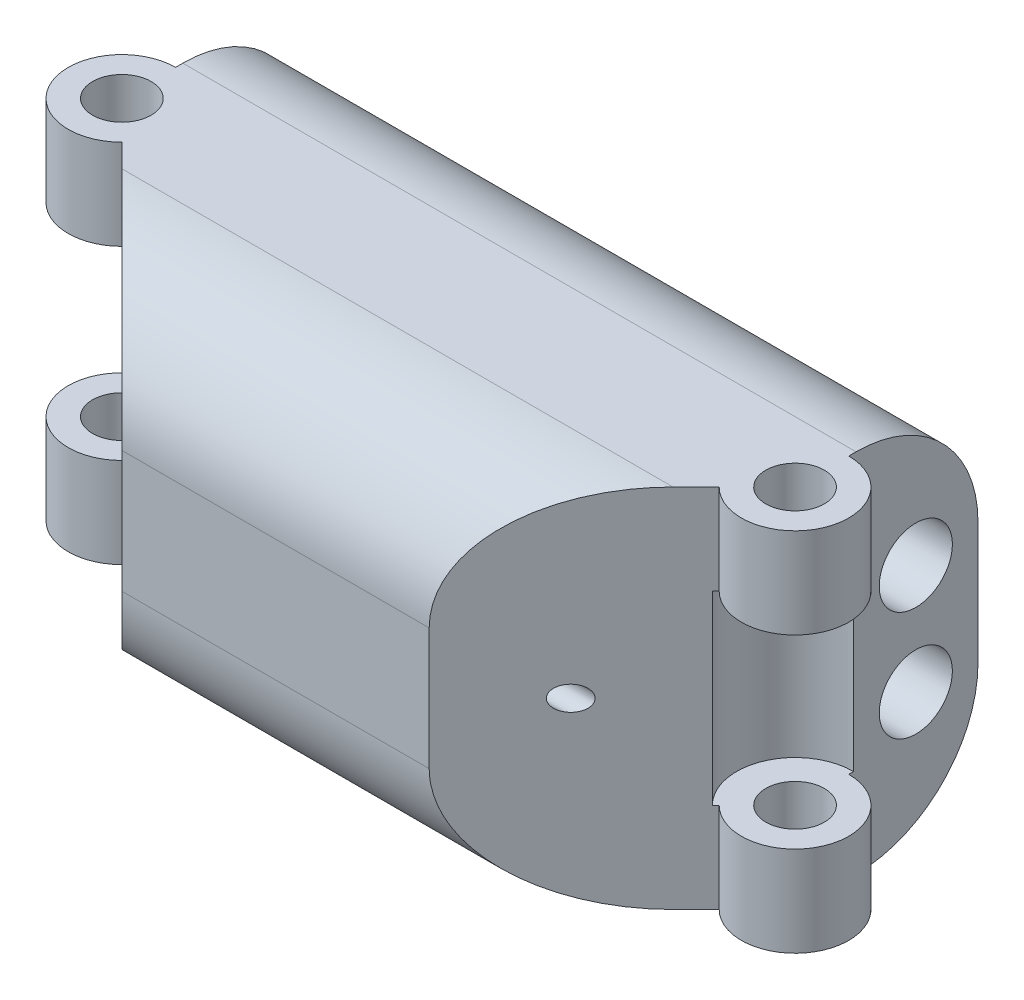
ISO-10303-21;
HEADER;
FILE_DESCRIPTION(('STEP AP214'),'2;1');
FILE_NAME('part.step','',(''),(''),'','','');
FILE_SCHEMA(('AUTOMOTIVE_DESIGN { 1 0 10303 214 1 1 1 1 }'));
ENDSEC;
DATA;
#1=APPLICATION_CONTEXT('core data for automotive mechanical design processes');
#2=APPLICATION_PROTOCOL_DEFINITION('international standard','automotive_design',2000,#1);
#3=PRODUCT_CONTEXT('',#1,'mechanical');
#4=PRODUCT('Part','Part','',(#3));
#5=PRODUCT_RELATED_PRODUCT_CATEGORY('part','',(#4));
#6=PRODUCT_DEFINITION_FORMATION('','',#4);
#7=PRODUCT_DEFINITION_CONTEXT('part definition',#1,'design');
#8=PRODUCT_DEFINITION('design','',#6,#7);
#9=PRODUCT_DEFINITION_SHAPE('','',#8);
#10=(LENGTH_UNIT() NAMED_UNIT(*) SI_UNIT(.MILLI.,.METRE.));
#11=(NAMED_UNIT(*) PLANE_ANGLE_UNIT() SI_UNIT($,.RADIAN.));
#12=(NAMED_UNIT(*) SI_UNIT($,.STERADIAN.) SOLID_ANGLE_UNIT());
#13=UNCERTAINTY_MEASURE_WITH_UNIT(LENGTH_MEASURE(1.E-05),#10,'distance_accuracy_value','');
#14=(GEOMETRIC_REPRESENTATION_CONTEXT(3) GLOBAL_UNCERTAINTY_ASSIGNED_CONTEXT((#13)) GLOBAL_UNIT_ASSIGNED_CONTEXT((#10,
#11,#12)) REPRESENTATION_CONTEXT('',''));
#15=CARTESIAN_POINT('',(0.,0.,0.));
#16=DIRECTION('',(0.,0.,1.));
#17=DIRECTION('',(1.,0.,0.));
#18=AXIS2_PLACEMENT_3D('',#15,#16,#17);
#19=CARTESIAN_POINT('',(-13.8,-7.5,0.));
#20=DIRECTION('',(0.,1.,0.));
#21=DIRECTION('',(0.,0.,1.));
#22=AXIS2_PLACEMENT_3D('',#19,#20,#21);
#23=CYLINDRICAL_SURFACE('',#22,2.4);
#24=CARTESIAN_POINT('',(-13.8,-3.8,0.));
#25=DIRECTION('',(0.,1.,0.));
#26=DIRECTION('',(0.,0.,-1.));
#27=AXIS2_PLACEMENT_3D('',#24,#25,#26);
#28=CIRCLE('',#27,2.4);
#29=CARTESIAN_POINT('',(-12.1029437251523,-3.8,1.69705627484772));
#30=VERTEX_POINT('',#29);
#31=CARTESIAN_POINT('',(-13.8,-3.8,-2.39999999999999));
#32=VERTEX_POINT('',#31);
#33=EDGE_CURVE('E226',#30,#32,#28,.T.);
#34=ORIENTED_EDGE('',*,*,#33,.F.);
#35=DIRECTION('',(0.,1.,0.));
#36=VECTOR('',#35,1.);
#37=CARTESIAN_POINT('',(-12.1029437251523,-7.5,1.69705627484771));
#38=LINE('',#37,#36);
#39=CARTESIAN_POINT('',(-12.1029437251523,3.8,1.69705627484771));
#40=VERTEX_POINT('',#39);
#41=EDGE_CURVE('E71',#30,#40,#38,.T.);
#42=ORIENTED_EDGE('',*,*,#41,.T.);
#43=CARTESIAN_POINT('',(-13.8,3.8,0.));
#44=DIRECTION('',(0.,1.,0.));
#45=DIRECTION('',(0.,0.,-1.));
#46=AXIS2_PLACEMENT_3D('',#43,#44,#45);
#47=CIRCLE('',#46,2.4);
#48=CARTESIAN_POINT('',(-13.8,3.8,-2.4));
#49=VERTEX_POINT('',#48);
#50=EDGE_CURVE('E276',#40,#49,#47,.T.);
#51=ORIENTED_EDGE('',*,*,#50,.T.);
#52=DIRECTION('',(0.,1.,0.));
#53=VECTOR('',#52,1.);
#54=CARTESIAN_POINT('',(-13.8,-7.5,-2.4));
#55=LINE('',#54,#53);
#56=EDGE_CURVE('E395',#32,#49,#55,.T.);
#57=ORIENTED_EDGE('',*,*,#56,.F.);
#58=EDGE_LOOP('',(#34,#42,#51,#57));
#59=FACE_BOUND('',#58,.T.);
#60=ADVANCED_FACE('F47',(#59),#23,.F.);
#61=CARTESIAN_POINT('',(13.8,-7.5,0.));
#62=DIRECTION('',(0.,1.,0.));
#63=DIRECTION('',(0.,0.,1.));
#64=AXIS2_PLACEMENT_3D('',#61,#62,#63);
#65=CYLINDRICAL_SURFACE('',#64,2.4);
#66=DIRECTION('',(0.,1.,0.));
#67=VECTOR('',#66,1.);
#68=CARTESIAN_POINT('',(12.1029437251523,-7.5,1.69705627484771));
#69=LINE('',#68,#67);
#70=CARTESIAN_POINT('',(12.1029437251523,-3.8,1.69705627484771));
#71=VERTEX_POINT('',#70);
#72=CARTESIAN_POINT('',(12.1029437251523,3.8,1.69705627484771));
#73=VERTEX_POINT('',#72);
#74=EDGE_CURVE('E63',#71,#73,#69,.T.);
#75=ORIENTED_EDGE('',*,*,#74,.F.);
#76=CARTESIAN_POINT('',(13.8,-3.8,0.));
#77=DIRECTION('',(0.,1.,0.));
#78=DIRECTION('',(0.,0.,1.));
#79=AXIS2_PLACEMENT_3D('',#76,#77,#78);
#80=CIRCLE('',#79,2.4);
#81=CARTESIAN_POINT('',(13.8,-3.8,-2.4));
#82=VERTEX_POINT('',#81);
#83=EDGE_CURVE('E243',#82,#71,#80,.T.);
#84=ORIENTED_EDGE('',*,*,#83,.F.);
#85=DIRECTION('',(0.,1.,0.));
#86=VECTOR('',#85,1.);
#87=CARTESIAN_POINT('',(13.8,-7.5,-2.4));
#88=LINE('',#87,#86);
#89=CARTESIAN_POINT('',(13.8,3.8,-2.4));
#90=VERTEX_POINT('',#89);
#91=EDGE_CURVE('E381',#82,#90,#88,.T.);
#92=ORIENTED_EDGE('',*,*,#91,.T.);
#93=CARTESIAN_POINT('',(13.8,3.8,0.));
#94=DIRECTION('',(0.,1.,0.));
#95=DIRECTION('',(0.,0.,1.));
#96=AXIS2_PLACEMENT_3D('',#93,#94,#95);
#97=CIRCLE('',#96,2.4);
#98=EDGE_CURVE('E324',#90,#73,#97,.T.);
#99=ORIENTED_EDGE('',*,*,#98,.T.);
#100=EDGE_LOOP('',(#75,#84,#92,#99));
#101=FACE_BOUND('',#100,.T.);
#102=ADVANCED_FACE('F500',(#101),#65,.F.);
#103=CARTESIAN_POINT('',(6.9,-7.5,6.9));
#104=DIRECTION('',(-0.707106781186547,0.,-0.707106781186548));
#105=DIRECTION('',(-0.707106781186548,0.,0.707106781186547));
#106=AXIS2_PLACEMENT_3D('',#103,#104,#105);
#107=PLANE('',#106);
#108=CARTESIAN_POINT('',(9.20147186257615,0.,4.59852813742385));
#109=DIRECTION('',(-0.707106781186547,0.,-0.707106781186548));
#110=DIRECTION('',(-0.707106781186548,0.,0.707106781186547));
#111=AXIS2_PLACEMENT_3D('',#108,#109,#110);
#112=ELLIPSE('',#111,0.707106781186548,0.5);
#113=CARTESIAN_POINT('',(8.70147186257615,0.,5.09852813742386));
#114=VERTEX_POINT('',#113);
#115=EDGE_CURVE('E340',#114,#114,#112,.T.);
#116=ORIENTED_EDGE('',*,*,#115,.T.);
#117=EDGE_LOOP('',(#116));
#118=FACE_BOUND('',#117,.T.);
#119=DIRECTION('',(-0.707106781186548,0.,0.707106781186547));
#120=VECTOR('',#119,1.);
#121=CARTESIAN_POINT('',(6.9,7.5,6.9));
#122=LINE('',#121,#120);
#123=CARTESIAN_POINT('',(12.2443650813896,7.5,1.5556349186104));
#124=VERTEX_POINT('',#123);
#125=CARTESIAN_POINT('',(11.3,7.5,2.5));
#126=VERTEX_POINT('',#125);
#127=EDGE_CURVE('E370',#124,#126,#122,.T.);
#128=ORIENTED_EDGE('',*,*,#127,.T.);
#129=CARTESIAN_POINT('',(11.3,2.5,2.5));
#130=DIRECTION('',(-0.707106781186547,0.,-0.707106781186548));
#131=DIRECTION('',(0.707106781186548,0.,-0.707106781186547));
#132=AXIS2_PLACEMENT_3D('',#129,#130,#131);
#133=ELLIPSE('',#132,7.07106781186548,5.);
#134=CARTESIAN_POINT('',(6.3,2.5,7.5));
#135=VERTEX_POINT('',#134);
#136=EDGE_CURVE('E56',#126,#135,#133,.F.);
#137=ORIENTED_EDGE('',*,*,#136,.T.);
#138=DIRECTION('',(0.,1.,0.));
#139=VECTOR('',#138,1.);
#140=CARTESIAN_POINT('',(6.3,-7.5,7.5));
#141=LINE('',#140,#139);
#142=CARTESIAN_POINT('',(6.3,-2.5,7.5));
#143=VERTEX_POINT('',#142);
#144=EDGE_CURVE('E385',#143,#135,#141,.T.);
#145=ORIENTED_EDGE('',*,*,#144,.F.);
#146=CARTESIAN_POINT('',(11.3,-2.5,2.5));
#147=DIRECTION('',(-0.707106781186547,0.,-0.707106781186548));
#148=DIRECTION('',(-0.707106781186548,0.,0.707106781186547));
#149=AXIS2_PLACEMENT_3D('',#146,#147,#148);
#150=ELLIPSE('',#149,7.07106781186548,5.);
#151=CARTESIAN_POINT('',(11.3,-7.5,2.5));
#152=VERTEX_POINT('',#151);
#153=EDGE_CURVE('E447',#143,#152,#150,.F.);
#154=ORIENTED_EDGE('',*,*,#153,.T.);
#155=DIRECTION('',(-0.707106781186548,0.,0.707106781186547));
#156=VECTOR('',#155,1.);
#157=CARTESIAN_POINT('',(6.9,-7.5,6.9));
#158=LINE('',#157,#156);
#159=CARTESIAN_POINT('',(12.2443650813896,-7.5,1.5556349186104));
#160=VERTEX_POINT('',#159);
#161=EDGE_CURVE('E378',#160,#152,#158,.T.);
#162=ORIENTED_EDGE('',*,*,#161,.F.);
#163=DIRECTION('',(0.,1.,0.));
#164=VECTOR('',#163,1.);
#165=CARTESIAN_POINT('',(12.2443650813896,-7.5,1.5556349186104));
#166=LINE('',#165,#164);
#167=CARTESIAN_POINT('',(12.2443650813896,-3.8,1.5556349186104));
#168=VERTEX_POINT('',#167);
#169=EDGE_CURVE('E252',#160,#168,#166,.T.);
#170=ORIENTED_EDGE('',*,*,#169,.T.);
#171=DIRECTION('',(0.707106781186548,0.,-0.707106781186546));
#172=VECTOR('',#171,1.);
#173=CARTESIAN_POINT('',(12.1029437251523,-3.8,1.69705627484771));
#174=LINE('',#173,#172);
#175=EDGE_CURVE('E257',#71,#168,#174,.T.);
#176=ORIENTED_EDGE('',*,*,#175,.F.);
#177=ORIENTED_EDGE('',*,*,#74,.T.);
#178=DIRECTION('',(0.707106781186548,0.,-0.707106781186546));
#179=VECTOR('',#178,1.);
#180=CARTESIAN_POINT('',(12.1029437251523,3.8,1.69705627484771));
#181=LINE('',#180,#179);
#182=CARTESIAN_POINT('',(12.2443650813896,3.8,1.5556349186104));
#183=VERTEX_POINT('',#182);
#184=EDGE_CURVE('E321',#73,#183,#181,.T.);
#185=ORIENTED_EDGE('',*,*,#184,.T.);
#186=DIRECTION('',(0.,-1.,0.));
#187=VECTOR('',#186,1.);
#188=CARTESIAN_POINT('',(12.2443650813896,7.5,1.5556349186104));
#189=LINE('',#188,#187);
#190=EDGE_CURVE('E237',#124,#183,#189,.T.);
#191=ORIENTED_EDGE('',*,*,#190,.F.);
#192=EDGE_LOOP('',(#128,#137,#145,#154,#162,#170,#176,#177,#185,#191));
#193=FACE_BOUND('',#192,.T.);
#194=ADVANCED_FACE('F452',(#118,#193),#107,.F.);
#195=CARTESIAN_POINT('',(0.,-7.5,7.5));
#196=DIRECTION('',(0.,0.,-1.));
#197=DIRECTION('',(-1.,0.,0.));
#198=AXIS2_PLACEMENT_3D('',#195,#196,#197);
#199=PLANE('',#198);
#200=ORIENTED_EDGE('',*,*,#144,.T.);
#201=DIRECTION('',(-1.,0.,0.));
#202=VECTOR('',#201,1.);
#203=CARTESIAN_POINT('',(-6.3,2.5,7.5));
#204=LINE('',#203,#202);
#205=CARTESIAN_POINT('',(-6.3,2.5,7.5));
#206=VERTEX_POINT('',#205);
#207=EDGE_CURVE('E434',#135,#206,#204,.T.);
#208=ORIENTED_EDGE('',*,*,#207,.T.);
#209=DIRECTION('',(0.,1.,0.));
#210=VECTOR('',#209,1.);
#211=CARTESIAN_POINT('',(-6.3,-7.5,7.5));
#212=LINE('',#211,#210);
#213=CARTESIAN_POINT('',(-6.3,-2.5,7.5));
#214=VERTEX_POINT('',#213);
#215=EDGE_CURVE('E389',#214,#206,#212,.T.);
#216=ORIENTED_EDGE('',*,*,#215,.F.);
#217=DIRECTION('',(-1.,0.,0.));
#218=VECTOR('',#217,1.);
#219=CARTESIAN_POINT('',(0.,-2.5,7.5));
#220=LINE('',#219,#218);
#221=EDGE_CURVE('E431',#214,#143,#220,.F.);
#222=ORIENTED_EDGE('',*,*,#221,.T.);
#223=EDGE_LOOP('',(#200,#208,#216,#222));
#224=FACE_BOUND('',#223,.T.);
#225=ADVANCED_FACE('F459',(#224),#199,.F.);
#226=CARTESIAN_POINT('',(-6.9,-7.5,6.9));
#227=DIRECTION('',(0.707106781186547,0.,-0.707106781186548));
#228=DIRECTION('',(-0.707106781186548,0.,-0.707106781186547));
#229=AXIS2_PLACEMENT_3D('',#226,#227,#228);
#230=PLANE('',#229);
#231=CARTESIAN_POINT('',(-9.20147186257615,0.,4.59852813742385));
#232=DIRECTION('',(0.707106781186547,0.,-0.707106781186548));
#233=DIRECTION('',(0.707106781186548,0.,0.707106781186547));
#234=AXIS2_PLACEMENT_3D('',#231,#232,#233);
#235=ELLIPSE('',#234,0.707106781186548,0.5);
#236=CARTESIAN_POINT('',(-8.70147186257615,0.,5.09852813742386));
#237=VERTEX_POINT('',#236);
#238=EDGE_CURVE('E305',#237,#237,#235,.F.);
#239=ORIENTED_EDGE('',*,*,#238,.F.);
#240=EDGE_LOOP('',(#239));
#241=FACE_BOUND('',#240,.T.);
#242=ORIENTED_EDGE('',*,*,#215,.T.);
#243=CARTESIAN_POINT('',(-11.3,2.5,2.5));
#244=DIRECTION('',(0.707106781186547,0.,-0.707106781186548));
#245=DIRECTION('',(0.707106781186548,0.,0.707106781186547));
#246=AXIS2_PLACEMENT_3D('',#243,#244,#245);
#247=ELLIPSE('',#246,7.07106781186548,5.);
#248=CARTESIAN_POINT('',(-11.3,7.5,2.5));
#249=VERTEX_POINT('',#248);
#250=EDGE_CURVE('E441',#206,#249,#247,.F.);
#251=ORIENTED_EDGE('',*,*,#250,.T.);
#252=DIRECTION('',(-0.707106781186548,0.,-0.707106781186547));
#253=VECTOR('',#252,1.);
#254=CARTESIAN_POINT('',(-6.9,7.5,6.9));
#255=LINE('',#254,#253);
#256=CARTESIAN_POINT('',(-12.2443650813896,7.5,1.55563491861041));
#257=VERTEX_POINT('',#256);
#258=EDGE_CURVE('E367',#249,#257,#255,.T.);
#259=ORIENTED_EDGE('',*,*,#258,.T.);
#260=DIRECTION('',(0.,-1.,0.));
#261=VECTOR('',#260,1.);
#262=CARTESIAN_POINT('',(-12.2443650813896,7.5,1.55563491861041));
#263=LINE('',#262,#261);
#264=CARTESIAN_POINT('',(-12.2443650813896,3.8,1.55563491861041));
#265=VERTEX_POINT('',#264);
#266=EDGE_CURVE('E286',#257,#265,#263,.T.);
#267=ORIENTED_EDGE('',*,*,#266,.T.);
#268=DIRECTION('',(0.707106781186548,0.,0.707106781186546));
#269=VECTOR('',#268,1.);
#270=CARTESIAN_POINT('',(-12.1029437251523,3.8,1.69705627484772));
#271=LINE('',#270,#269);
#272=EDGE_CURVE('E287',#265,#40,#271,.T.);
#273=ORIENTED_EDGE('',*,*,#272,.T.);
#274=ORIENTED_EDGE('',*,*,#41,.F.);
#275=DIRECTION('',(0.707106781186548,0.,0.707106781186546));
#276=VECTOR('',#275,1.);
#277=CARTESIAN_POINT('',(-12.1029437251523,-3.8,1.69705627484772));
#278=LINE('',#277,#276);
#279=CARTESIAN_POINT('',(-12.2443650813896,-3.8,1.55563491861041));
#280=VERTEX_POINT('',#279);
#281=EDGE_CURVE('E218',#280,#30,#278,.T.);
#282=ORIENTED_EDGE('',*,*,#281,.F.);
#283=DIRECTION('',(0.,1.,0.));
#284=VECTOR('',#283,1.);
#285=CARTESIAN_POINT('',(-12.2443650813896,-7.5,1.55563491861041));
#286=LINE('',#285,#284);
#287=CARTESIAN_POINT('',(-12.2443650813896,-7.5,1.55563491861041));
#288=VERTEX_POINT('',#287);
#289=EDGE_CURVE('E210',#288,#280,#286,.T.);
#290=ORIENTED_EDGE('',*,*,#289,.F.);
#291=DIRECTION('',(-0.707106781186548,0.,-0.707106781186547));
#292=VECTOR('',#291,1.);
#293=CARTESIAN_POINT('',(-6.9,-7.5,6.9));
#294=LINE('',#293,#292);
#295=CARTESIAN_POINT('',(-11.3,-7.5,2.5));
#296=VERTEX_POINT('',#295);
#297=EDGE_CURVE('E199',#296,#288,#294,.T.);
#298=ORIENTED_EDGE('',*,*,#297,.F.);
#299=CARTESIAN_POINT('',(-11.3,-2.5,2.5));
#300=DIRECTION('',(0.707106781186547,0.,-0.707106781186548));
#301=DIRECTION('',(-0.707106781186548,0.,-0.707106781186547));
#302=AXIS2_PLACEMENT_3D('',#299,#300,#301);
#303=ELLIPSE('',#302,7.07106781186548,5.);
#304=EDGE_CURVE('E438',#296,#214,#303,.F.);
#305=ORIENTED_EDGE('',*,*,#304,.T.);
#306=EDGE_LOOP('',(#242,#251,#259,#267,#273,#274,#282,#290,#298,#305));
#307=FACE_BOUND('',#306,.T.);
#308=ADVANCED_FACE('F465',(#241,#307),#230,.F.);
#309=CARTESIAN_POINT('',(-13.8,-7.5,0.));
#310=DIRECTION('',(1.,0.,0.));
#311=DIRECTION('',(0.,0.,-1.));
#312=AXIS2_PLACEMENT_3D('',#309,#310,#311);
#313=PLANE('',#312);
#314=CARTESIAN_POINT('',(-13.8,-2.25,-4.95));
#315=DIRECTION('',(1.,0.,0.));
#316=DIRECTION('',(0.,0.,-1.));
#317=AXIS2_PLACEMENT_3D('',#314,#315,#316);
#318=CIRCLE('',#317,1.5);
#319=CARTESIAN_POINT('',(-13.8,-2.25,-6.45));
#320=VERTEX_POINT('',#319);
#321=EDGE_CURVE('E349',#320,#320,#318,.F.);
#322=ORIENTED_EDGE('',*,*,#321,.F.);
#323=EDGE_LOOP('',(#322));
#324=FACE_BOUND('',#323,.T.);
#325=CARTESIAN_POINT('',(-13.8,2.25,-4.95));
#326=DIRECTION('',(1.,0.,0.));
#327=DIRECTION('',(0.,0.,-1.));
#328=AXIS2_PLACEMENT_3D('',#325,#326,#327);
#329=CIRCLE('',#328,1.5);
#330=CARTESIAN_POINT('',(-13.8,2.25,-6.45));
#331=VERTEX_POINT('',#330);
#332=EDGE_CURVE('E350',#331,#331,#329,.F.);
#333=ORIENTED_EDGE('',*,*,#332,.F.);
#334=EDGE_LOOP('',(#333));
#335=FACE_BOUND('',#334,.T.);
#336=DIRECTION('',(0.,1.,0.));
#337=VECTOR('',#336,1.);
#338=CARTESIAN_POINT('',(-13.8,-7.5,-7.5));
#339=LINE('',#338,#337);
#340=CARTESIAN_POINT('',(-13.8,-2.5,-7.5));
#341=VERTEX_POINT('',#340);
#342=CARTESIAN_POINT('',(-13.8,2.5,-7.5));
#343=VERTEX_POINT('',#342);
#344=EDGE_CURVE('E398',#341,#343,#339,.T.);
#345=ORIENTED_EDGE('',*,*,#344,.F.);
#346=CARTESIAN_POINT('',(-13.8,-2.5,-2.5));
#347=DIRECTION('',(1.,0.,0.));
#348=DIRECTION('',(0.,0.,-1.));
#349=AXIS2_PLACEMENT_3D('',#346,#347,#348);
#350=CIRCLE('',#349,5.);
#351=CARTESIAN_POINT('',(-13.8,-7.5,-2.5));
#352=VERTEX_POINT('',#351);
#353=EDGE_CURVE('E193',#341,#352,#350,.F.);
#354=ORIENTED_EDGE('',*,*,#353,.T.);
#355=DIRECTION('',(0.,0.,-1.));
#356=VECTOR('',#355,1.);
#357=CARTESIAN_POINT('',(-13.8,-7.5,0.));
#358=LINE('',#357,#356);
#359=CARTESIAN_POINT('',(-13.8,-7.5,-2.19999999999999));
#360=VERTEX_POINT('',#359);
#361=EDGE_CURVE('E186',#360,#352,#358,.T.);
#362=ORIENTED_EDGE('',*,*,#361,.F.);
#363=DIRECTION('',(0.,1.,0.));
#364=VECTOR('',#363,1.);
#365=CARTESIAN_POINT('',(-13.8,-7.5,-2.19999999999999));
#366=LINE('',#365,#364);
#367=CARTESIAN_POINT('',(-13.8,-3.8,-2.19999999999999));
#368=VERTEX_POINT('',#367);
#369=EDGE_CURVE('E190',#360,#368,#366,.T.);
#370=ORIENTED_EDGE('',*,*,#369,.T.);
#371=DIRECTION('',(0.,0.,1.));
#372=VECTOR('',#371,1.);
#373=CARTESIAN_POINT('',(-13.8,-3.8,-2.39999999999999));
#374=LINE('',#373,#372);
#375=EDGE_CURVE('E230',#32,#368,#374,.T.);
#376=ORIENTED_EDGE('',*,*,#375,.F.);
#377=ORIENTED_EDGE('',*,*,#56,.T.);
#378=DIRECTION('',(0.,0.,1.));
#379=VECTOR('',#378,1.);
#380=CARTESIAN_POINT('',(-13.8,3.8,-2.39999999999999));
#381=LINE('',#380,#379);
#382=CARTESIAN_POINT('',(-13.8,3.8,-2.19999999999999));
#383=VERTEX_POINT('',#382);
#384=EDGE_CURVE('E290',#49,#383,#381,.T.);
#385=ORIENTED_EDGE('',*,*,#384,.T.);
#386=DIRECTION('',(0.,-1.,0.));
#387=VECTOR('',#386,1.);
#388=CARTESIAN_POINT('',(-13.8,7.5,-2.19999999999999));
#389=LINE('',#388,#387);
#390=CARTESIAN_POINT('',(-13.8,7.5,-2.19999999999999));
#391=VERTEX_POINT('',#390);
#392=EDGE_CURVE('E301',#391,#383,#389,.T.);
#393=ORIENTED_EDGE('',*,*,#392,.F.);
#394=DIRECTION('',(0.,0.,-1.));
#395=VECTOR('',#394,1.);
#396=CARTESIAN_POINT('',(-13.8,7.5,0.));
#397=LINE('',#396,#395);
#398=CARTESIAN_POINT('',(-13.8,7.5,-2.5));
#399=VERTEX_POINT('',#398);
#400=EDGE_CURVE('E363',#391,#399,#397,.T.);
#401=ORIENTED_EDGE('',*,*,#400,.T.);
#402=CARTESIAN_POINT('',(-13.8,2.5,-2.5));
#403=DIRECTION('',(1.,0.,0.));
#404=DIRECTION('',(0.,0.,-1.));
#405=AXIS2_PLACEMENT_3D('',#402,#403,#404);
#406=CIRCLE('',#405,5.);
#407=EDGE_CURVE('E423',#399,#343,#406,.F.);
#408=ORIENTED_EDGE('',*,*,#407,.T.);
#409=EDGE_LOOP('',(#345,#354,#362,#370,#376,#377,#385,#393,#401,#408));
#410=FACE_BOUND('',#409,.T.);
#411=ADVANCED_FACE('F189',(#324,#335,#410),#313,.F.);
#412=CARTESIAN_POINT('',(0.,-7.5,-7.5));
#413=DIRECTION('',(0.,0.,1.));
#414=DIRECTION('',(1.,0.,0.));
#415=AXIS2_PLACEMENT_3D('',#412,#413,#414);
#416=PLANE('',#415);
#417=DIRECTION('',(0.,1.,0.));
#418=VECTOR('',#417,1.);
#419=CARTESIAN_POINT('',(13.8,-7.5,-7.5));
#420=LINE('',#419,#418);
#421=CARTESIAN_POINT('',(13.8,-2.5,-7.5));
#422=VERTEX_POINT('',#421);
#423=CARTESIAN_POINT('',(13.8,2.5,-7.5));
#424=VERTEX_POINT('',#423);
#425=EDGE_CURVE('E402',#422,#424,#420,.T.);
#426=ORIENTED_EDGE('',*,*,#425,.F.);
#427=DIRECTION('',(1.,0.,0.));
#428=VECTOR('',#427,1.);
#429=CARTESIAN_POINT('',(0.,-2.5,-7.5));
#430=LINE('',#429,#428);
#431=EDGE_CURVE('E420',#422,#341,#430,.F.);
#432=ORIENTED_EDGE('',*,*,#431,.T.);
#433=ORIENTED_EDGE('',*,*,#344,.T.);
#434=DIRECTION('',(1.,0.,0.));
#435=VECTOR('',#434,1.);
#436=CARTESIAN_POINT('',(13.8,2.5,-7.5));
#437=LINE('',#436,#435);
#438=EDGE_CURVE('E416',#343,#424,#437,.T.);
#439=ORIENTED_EDGE('',*,*,#438,.T.);
#440=EDGE_LOOP('',(#426,#432,#433,#439));
#441=FACE_BOUND('',#440,.T.);
#442=ADVANCED_FACE('F521',(#441),#416,.F.);
#443=CARTESIAN_POINT('',(13.8,-7.5,0.));
#444=DIRECTION('',(-1.,0.,0.));
#445=DIRECTION('',(0.,0.,1.));
#446=AXIS2_PLACEMENT_3D('',#443,#444,#445);
#447=PLANE('',#446);
#448=CARTESIAN_POINT('',(13.8,-2.25,-4.95));
#449=DIRECTION('',(1.,0.,0.));
#450=DIRECTION('',(0.,0.,-1.));
#451=AXIS2_PLACEMENT_3D('',#448,#449,#450);
#452=CIRCLE('',#451,1.5);
#453=CARTESIAN_POINT('',(13.8,-2.25,-6.45));
#454=VERTEX_POINT('',#453);
#455=EDGE_CURVE('E345',#454,#454,#452,.T.);
#456=ORIENTED_EDGE('',*,*,#455,.F.);
#457=EDGE_LOOP('',(#456));
#458=FACE_BOUND('',#457,.T.);
#459=CARTESIAN_POINT('',(13.8,2.25,-4.95));
#460=DIRECTION('',(1.,0.,0.));
#461=DIRECTION('',(0.,0.,-1.));
#462=AXIS2_PLACEMENT_3D('',#459,#460,#461);
#463=CIRCLE('',#462,1.5);
#464=CARTESIAN_POINT('',(13.8,2.25,-6.45));
#465=VERTEX_POINT('',#464);
#466=EDGE_CURVE('E344',#465,#465,#463,.T.);
#467=ORIENTED_EDGE('',*,*,#466,.F.);
#468=EDGE_LOOP('',(#467));
#469=FACE_BOUND('',#468,.T.);
#470=DIRECTION('',(0.,0.,1.));
#471=VECTOR('',#470,1.);
#472=CARTESIAN_POINT('',(13.8,-7.5,0.));
#473=LINE('',#472,#471);
#474=CARTESIAN_POINT('',(13.8,-7.5,-2.5));
#475=VERTEX_POINT('',#474);
#476=CARTESIAN_POINT('',(13.8,-7.5,-2.2));
#477=VERTEX_POINT('',#476);
#478=EDGE_CURVE('E200',#475,#477,#473,.T.);
#479=ORIENTED_EDGE('',*,*,#478,.F.);
#480=CARTESIAN_POINT('',(13.8,-2.5,-2.5));
#481=DIRECTION('',(-1.,0.,0.));
#482=DIRECTION('',(0.,0.,1.));
#483=AXIS2_PLACEMENT_3D('',#480,#481,#482);
#484=CIRCLE('',#483,5.);
#485=EDGE_CURVE('E413',#475,#422,#484,.F.);
#486=ORIENTED_EDGE('',*,*,#485,.T.);
#487=ORIENTED_EDGE('',*,*,#425,.T.);
#488=CARTESIAN_POINT('',(13.8,2.5,-2.5));
#489=DIRECTION('',(-1.,0.,0.));
#490=DIRECTION('',(0.,0.,1.));
#491=AXIS2_PLACEMENT_3D('',#488,#489,#490);
#492=CIRCLE('',#491,5.);
#493=CARTESIAN_POINT('',(13.8,7.5,-2.5));
#494=VERTEX_POINT('',#493);
#495=EDGE_CURVE('E410',#424,#494,#492,.F.);
#496=ORIENTED_EDGE('',*,*,#495,.T.);
#497=DIRECTION('',(0.,0.,1.));
#498=VECTOR('',#497,1.);
#499=CARTESIAN_POINT('',(13.8,7.5,0.));
#500=LINE('',#499,#498);
#501=CARTESIAN_POINT('',(13.8,7.5,-2.2));
#502=VERTEX_POINT('',#501);
#503=EDGE_CURVE('E354',#494,#502,#500,.T.);
#504=ORIENTED_EDGE('',*,*,#503,.T.);
#505=DIRECTION('',(0.,-1.,0.));
#506=VECTOR('',#505,1.);
#507=CARTESIAN_POINT('',(13.8,7.5,-2.2));
#508=LINE('',#507,#506);
#509=CARTESIAN_POINT('',(13.8,3.8,-2.2));
#510=VERTEX_POINT('',#509);
#511=EDGE_CURVE('E309',#502,#510,#508,.T.);
#512=ORIENTED_EDGE('',*,*,#511,.T.);
#513=DIRECTION('',(0.,0.,-1.));
#514=VECTOR('',#513,1.);
#515=CARTESIAN_POINT('',(13.8,3.8,-2.4));
#516=LINE('',#515,#514);
#517=EDGE_CURVE('E314',#510,#90,#516,.T.);
#518=ORIENTED_EDGE('',*,*,#517,.T.);
#519=ORIENTED_EDGE('',*,*,#91,.F.);
#520=DIRECTION('',(0.,0.,-1.));
#521=VECTOR('',#520,1.);
#522=CARTESIAN_POINT('',(13.8,-3.8,-2.4));
#523=LINE('',#522,#521);
#524=CARTESIAN_POINT('',(13.8,-3.8,-2.2));
#525=VERTEX_POINT('',#524);
#526=EDGE_CURVE('E253',#525,#82,#523,.T.);
#527=ORIENTED_EDGE('',*,*,#526,.F.);
#528=DIRECTION('',(0.,1.,0.));
#529=VECTOR('',#528,1.);
#530=CARTESIAN_POINT('',(13.8,-7.5,-2.2));
#531=LINE('',#530,#529);
#532=EDGE_CURVE('E267',#477,#525,#531,.T.);
#533=ORIENTED_EDGE('',*,*,#532,.F.);
#534=EDGE_LOOP('',(#479,#486,#487,#496,#504,#512,#518,#519,#527,#533));
#535=FACE_BOUND('',#534,.T.);
#536=ADVANCED_FACE('F525',(#458,#469,#535),#447,.F.);
#537=CARTESIAN_POINT('',(0.,-7.5,0.));
#538=DIRECTION('',(0.,1.,0.));
#539=DIRECTION('',(0.,0.,1.));
#540=AXIS2_PLACEMENT_3D('',#537,#538,#539);
#541=PLANE('',#540);
#542=ORIENTED_EDGE('',*,*,#161,.T.);
#543=DIRECTION('',(-1.,0.,0.));
#544=VECTOR('',#543,1.);
#545=CARTESIAN_POINT('',(0.,-7.5,2.5));
#546=LINE('',#545,#544);
#547=EDGE_CURVE('E11',#152,#296,#546,.T.);
#548=ORIENTED_EDGE('',*,*,#547,.T.);
#549=ORIENTED_EDGE('',*,*,#297,.T.);
#550=CARTESIAN_POINT('',(-13.8,-7.5,0.));
#551=DIRECTION('',(0.,1.,0.));
#552=DIRECTION('',(0.,0.,-1.));
#553=AXIS2_PLACEMENT_3D('',#550,#551,#552);
#554=CIRCLE('',#553,2.2);
#555=EDGE_CURVE('E205',#360,#288,#554,.T.);
#556=ORIENTED_EDGE('',*,*,#555,.F.);
#557=ORIENTED_EDGE('',*,*,#361,.T.);
#558=DIRECTION('',(1.,0.,0.));
#559=VECTOR('',#558,1.);
#560=CARTESIAN_POINT('',(0.,-7.5,-2.5));
#561=LINE('',#560,#559);
#562=EDGE_CURVE('E384',#352,#475,#561,.T.);
#563=ORIENTED_EDGE('',*,*,#562,.T.);
#564=ORIENTED_EDGE('',*,*,#478,.T.);
#565=CARTESIAN_POINT('',(13.8,-7.5,0.));
#566=DIRECTION('',(0.,1.,0.));
#567=DIRECTION('',(0.,0.,1.));
#568=AXIS2_PLACEMENT_3D('',#565,#566,#567);
#569=CIRCLE('',#568,2.2);
#570=EDGE_CURVE('E248',#160,#477,#569,.T.);
#571=ORIENTED_EDGE('',*,*,#570,.F.);
#572=EDGE_LOOP('',(#542,#548,#549,#556,#557,#563,#564,#571));
#573=FACE_BOUND('',#572,.T.);
#574=CARTESIAN_POINT('',(13.8,-7.5,0.));
#575=DIRECTION('',(0.,1.,0.));
#576=DIRECTION('',(0.,0.,1.));
#577=AXIS2_PLACEMENT_3D('',#574,#575,#576);
#578=CIRCLE('',#577,1.2);
#579=CARTESIAN_POINT('',(13.8,-7.5,1.2));
#580=VERTEX_POINT('',#579);
#581=EDGE_CURVE('E239',#580,#580,#578,.T.);
#582=ORIENTED_EDGE('',*,*,#581,.T.);
#583=EDGE_LOOP('',(#582));
#584=FACE_BOUND('',#583,.T.);
#585=CARTESIAN_POINT('',(-13.8,-7.5,0.));
#586=DIRECTION('',(0.,1.,0.));
#587=DIRECTION('',(0.,0.,-1.));
#588=AXIS2_PLACEMENT_3D('',#585,#586,#587);
#589=CIRCLE('',#588,1.2);
#590=CARTESIAN_POINT('',(-13.8,-7.5,-1.19999999999999));
#591=VERTEX_POINT('',#590);
#592=EDGE_CURVE('E231',#591,#591,#589,.T.);
#593=ORIENTED_EDGE('',*,*,#592,.T.);
#594=EDGE_LOOP('',(#593));
#595=FACE_BOUND('',#594,.T.);
#596=ADVANCED_FACE('F213',(#573,#584,#595),#541,.F.);
#597=CARTESIAN_POINT('',(0.,7.5,0.));
#598=DIRECTION('',(0.,1.,0.));
#599=DIRECTION('',(0.,0.,1.));
#600=AXIS2_PLACEMENT_3D('',#597,#598,#599);
#601=PLANE('',#600);
#602=ORIENTED_EDGE('',*,*,#258,.F.);
#603=DIRECTION('',(-1.,0.,0.));
#604=VECTOR('',#603,1.);
#605=CARTESIAN_POINT('',(6.3,7.5,2.5));
#606=LINE('',#605,#604);
#607=EDGE_CURVE('E444',#249,#126,#606,.F.);
#608=ORIENTED_EDGE('',*,*,#607,.T.);
#609=ORIENTED_EDGE('',*,*,#127,.F.);
#610=CARTESIAN_POINT('',(13.8,7.5,0.));
#611=DIRECTION('',(0.,1.,0.));
#612=DIRECTION('',(0.,0.,1.));
#613=AXIS2_PLACEMENT_3D('',#610,#611,#612);
#614=CIRCLE('',#613,2.2);
#615=EDGE_CURVE('E313',#124,#502,#614,.T.);
#616=ORIENTED_EDGE('',*,*,#615,.T.);
#617=ORIENTED_EDGE('',*,*,#503,.F.);
#618=DIRECTION('',(1.,0.,0.));
#619=VECTOR('',#618,1.);
#620=CARTESIAN_POINT('',(-13.8,7.5,-2.5));
#621=LINE('',#620,#619);
#622=EDGE_CURVE('E428',#494,#399,#621,.F.);
#623=ORIENTED_EDGE('',*,*,#622,.T.);
#624=ORIENTED_EDGE('',*,*,#400,.F.);
#625=CARTESIAN_POINT('',(-13.8,7.5,0.));
#626=DIRECTION('',(0.,1.,0.));
#627=DIRECTION('',(0.,0.,-1.));
#628=AXIS2_PLACEMENT_3D('',#625,#626,#627);
#629=CIRCLE('',#628,2.2);
#630=EDGE_CURVE('E282',#391,#257,#629,.T.);
#631=ORIENTED_EDGE('',*,*,#630,.T.);
#632=EDGE_LOOP('',(#602,#608,#609,#616,#617,#623,#624,#631));
#633=FACE_BOUND('',#632,.T.);
#634=CARTESIAN_POINT('',(13.8,7.5,0.));
#635=DIRECTION('',(0.,1.,0.));
#636=DIRECTION('',(0.,0.,1.));
#637=AXIS2_PLACEMENT_3D('',#634,#635,#636);
#638=CIRCLE('',#637,1.2);
#639=CARTESIAN_POINT('',(13.8,7.5,1.2));
#640=VERTEX_POINT('',#639);
#641=EDGE_CURVE('E327',#640,#640,#638,.T.);
#642=ORIENTED_EDGE('',*,*,#641,.F.);
#643=EDGE_LOOP('',(#642));
#644=FACE_BOUND('',#643,.T.);
#645=CARTESIAN_POINT('',(-13.8,7.5,0.));
#646=DIRECTION('',(0.,1.,0.));
#647=DIRECTION('',(0.,0.,-1.));
#648=AXIS2_PLACEMENT_3D('',#645,#646,#647);
#649=CIRCLE('',#648,1.2);
#650=CARTESIAN_POINT('',(-13.8,7.5,-1.19999999999999));
#651=VERTEX_POINT('',#650);
#652=EDGE_CURVE('E272',#651,#651,#649,.T.);
#653=ORIENTED_EDGE('',*,*,#652,.F.);
#654=EDGE_LOOP('',(#653));
#655=FACE_BOUND('',#654,.T.);
#656=ADVANCED_FACE('F467',(#633,#644,#655),#601,.T.);
#657=CARTESIAN_POINT('',(-13.801,2.25,-4.95));
#658=DIRECTION('',(1.,0.,0.));
#659=DIRECTION('',(0.,0.,-1.));
#660=AXIS2_PLACEMENT_3D('',#657,#658,#659);
#661=CYLINDRICAL_SURFACE('',#660,1.5);
#662=CARTESIAN_POINT('',(13.8,2.25,-6.45));
#663=CARTESIAN_POINT('',(13.5125,2.25,-6.45));
#664=CARTESIAN_POINT('',(13.225,2.25,-6.45));
#665=CARTESIAN_POINT('',(12.65,2.25,-6.45));
#666=CARTESIAN_POINT('',(12.3625,2.25,-6.45));
#667=CARTESIAN_POINT('',(11.7875,2.25,-6.45));
#668=CARTESIAN_POINT('',(11.5,2.25,-6.45));
#669=CARTESIAN_POINT('',(10.925,2.25,-6.45));
#670=CARTESIAN_POINT('',(10.6375,2.25,-6.45));
#671=CARTESIAN_POINT('',(10.0625,2.25,-6.45));
#672=CARTESIAN_POINT('',(9.775,2.25,-6.45));
#673=CARTESIAN_POINT('',(9.2,2.25,-6.45));
#674=CARTESIAN_POINT('',(8.9125,2.25,-6.45));
#675=CARTESIAN_POINT('',(8.3375,2.25,-6.45));
#676=CARTESIAN_POINT('',(8.05,2.25,-6.45));
#677=CARTESIAN_POINT('',(7.475,2.25,-6.45));
#678=CARTESIAN_POINT('',(7.1875,2.25,-6.45));
#679=CARTESIAN_POINT('',(6.6125,2.25,-6.45));
#680=CARTESIAN_POINT('',(6.32499999999999,2.25,-6.45));
#681=CARTESIAN_POINT('',(5.74999999999999,2.25,-6.45));
#682=CARTESIAN_POINT('',(5.4625,2.25,-6.45));
#683=CARTESIAN_POINT('',(4.88749999999999,2.25,-6.45));
#684=CARTESIAN_POINT('',(4.59999999999999,2.25,-6.45));
#685=CARTESIAN_POINT('',(4.02499999999999,2.25,-6.45));
#686=CARTESIAN_POINT('',(3.73749999999999,2.25,-6.45));
#687=CARTESIAN_POINT('',(3.1625,2.25,-6.45));
#688=CARTESIAN_POINT('',(2.875,2.25,-6.45));
#689=CARTESIAN_POINT('',(2.3,2.25,-6.45));
#690=CARTESIAN_POINT('',(2.0125,2.25,-6.45));
#691=CARTESIAN_POINT('',(1.4375,2.25,-6.45));
#692=CARTESIAN_POINT('',(1.15,2.25,-6.45));
#693=CARTESIAN_POINT('',(0.574999999999997,2.25,-6.45));
#694=CARTESIAN_POINT('',(0.287499999999997,2.25,-6.45));
#695=CARTESIAN_POINT('',(-0.287500000000004,2.25,-6.45));
#696=CARTESIAN_POINT('',(-0.575000000000004,2.25,-6.45));
#697=CARTESIAN_POINT('',(-1.15,2.25,-6.45));
#698=CARTESIAN_POINT('',(-1.4375,2.25,-6.45));
#699=CARTESIAN_POINT('',(-2.0125,2.25,-6.45));
#700=CARTESIAN_POINT('',(-2.3,2.25,-6.45));
#701=CARTESIAN_POINT('',(-2.875,2.25,-6.45));
#702=CARTESIAN_POINT('',(-3.1625,2.25,-6.45));
#703=CARTESIAN_POINT('',(-3.7375,2.25,-6.45));
#704=CARTESIAN_POINT('',(-4.025,2.25,-6.45));
#705=CARTESIAN_POINT('',(-4.6,2.25,-6.45));
#706=CARTESIAN_POINT('',(-4.8875,2.25,-6.45));
#707=CARTESIAN_POINT('',(-5.4625,2.25,-6.45));
#708=CARTESIAN_POINT('',(-5.75,2.25,-6.45));
#709=CARTESIAN_POINT('',(-6.325,2.25,-6.45));
#710=CARTESIAN_POINT('',(-6.6125,2.25,-6.45));
#711=CARTESIAN_POINT('',(-7.1875,2.25,-6.45));
#712=CARTESIAN_POINT('',(-7.475,2.25,-6.45));
#713=CARTESIAN_POINT('',(-8.05,2.25,-6.45));
#714=CARTESIAN_POINT('',(-8.3375,2.25,-6.45));
#715=CARTESIAN_POINT('',(-8.9125,2.25,-6.45));
#716=CARTESIAN_POINT('',(-9.2,2.25,-6.45));
#717=CARTESIAN_POINT('',(-9.775,2.25,-6.45));
#718=CARTESIAN_POINT('',(-10.0625,2.25,-6.45));
#719=CARTESIAN_POINT('',(-10.6375,2.25,-6.45));
#720=CARTESIAN_POINT('',(-10.925,2.25,-6.45));
#721=CARTESIAN_POINT('',(-11.5,2.25,-6.45));
#722=CARTESIAN_POINT('',(-11.7875,2.25,-6.45));
#723=CARTESIAN_POINT('',(-12.3625,2.25,-6.45));
#724=CARTESIAN_POINT('',(-12.65,2.25,-6.45));
#725=CARTESIAN_POINT('',(-13.225,2.25,-6.45));
#726=CARTESIAN_POINT('',(-13.5125,2.25,-6.45));
#727=CARTESIAN_POINT('',(-13.8,2.25,-6.45));
#728=B_SPLINE_CURVE_WITH_KNOTS('',3,(#662,#663,#664,#665,#666,#667,#668,#669,#670,#671,#672,
#673,#674,#675,#676,#677,#678,#679,#680,#681,#682,#683,#684,#685,#686,#687,#688,#689,#690,#691,
#692,#693,#694,#695,#696,#697,#698,#699,#700,#701,#702,#703,#704,#705,#706,#707,#708,#709,#710,
#711,#712,#713,#714,#715,#716,#717,#718,#719,#720,#721,#722,#723,#724,#725,#726,#727),
.UNSPECIFIED.,.F.,.F.,(4,2,2,2,2,2,2,2,2,2,2,2,2,2,2,2,2,2,2,2,2,2,2,2,2,2,2,2,2,2,2,2,4),(0.,
0.862499999999999,1.725,2.5875,3.45,4.3125,5.175,6.0375,6.9,7.7625,8.625,9.4875,10.35,11.2125,
12.075,12.9375,13.8,14.6625,15.525,16.3875,17.25,18.1125,18.975,19.8375,20.7,21.5625,22.425,
23.2875,24.15,25.0125,25.875,26.7375,27.6),.UNSPECIFIED.);
#729=EDGE_CURVE('BSEAM557',#465,#331,#728,.T.);
#730=ORIENTED_EDGE('',*,*,#466,.T.);
#731=ORIENTED_EDGE('',*,*,#332,.T.);
#732=ORIENTED_EDGE('',*,*,#729,.T.);
#733=ORIENTED_EDGE('',*,*,#729,.F.);
#734=EDGE_LOOP('',(#730,#732,#731,#733));
#735=FACE_BOUND('',#734,.T.);
#736=ADVANCED_FACE('F557',(#735),#661,.F.);
#737=CARTESIAN_POINT('',(-13.801,-2.25,-4.95));
#738=DIRECTION('',(1.,0.,0.));
#739=DIRECTION('',(0.,0.,-1.));
#740=AXIS2_PLACEMENT_3D('',#737,#738,#739);
#741=CYLINDRICAL_SURFACE('',#740,1.5);
#742=CARTESIAN_POINT('',(13.8,-2.25,-6.45));
#743=CARTESIAN_POINT('',(13.5125,-2.25,-6.45));
#744=CARTESIAN_POINT('',(13.225,-2.25,-6.45));
#745=CARTESIAN_POINT('',(12.65,-2.25,-6.45));
#746=CARTESIAN_POINT('',(12.3625,-2.25,-6.45));
#747=CARTESIAN_POINT('',(11.7875,-2.25,-6.45));
#748=CARTESIAN_POINT('',(11.5,-2.25,-6.45));
#749=CARTESIAN_POINT('',(10.925,-2.25,-6.45));
#750=CARTESIAN_POINT('',(10.6375,-2.25,-6.45));
#751=CARTESIAN_POINT('',(10.0625,-2.25,-6.45));
#752=CARTESIAN_POINT('',(9.775,-2.25,-6.45));
#753=CARTESIAN_POINT('',(9.2,-2.25,-6.45));
#754=CARTESIAN_POINT('',(8.9125,-2.25,-6.45));
#755=CARTESIAN_POINT('',(8.3375,-2.25,-6.45));
#756=CARTESIAN_POINT('',(8.05,-2.25,-6.45));
#757=CARTESIAN_POINT('',(7.475,-2.25,-6.45));
#758=CARTESIAN_POINT('',(7.1875,-2.25,-6.45));
#759=CARTESIAN_POINT('',(6.6125,-2.25,-6.45));
#760=CARTESIAN_POINT('',(6.32499999999999,-2.25,-6.45));
#761=CARTESIAN_POINT('',(5.74999999999999,-2.25,-6.45));
#762=CARTESIAN_POINT('',(5.4625,-2.25,-6.45));
#763=CARTESIAN_POINT('',(4.88749999999999,-2.25,-6.45));
#764=CARTESIAN_POINT('',(4.59999999999999,-2.25,-6.45));
#765=CARTESIAN_POINT('',(4.02499999999999,-2.25,-6.45));
#766=CARTESIAN_POINT('',(3.73749999999999,-2.25,-6.45));
#767=CARTESIAN_POINT('',(3.1625,-2.25,-6.45));
#768=CARTESIAN_POINT('',(2.875,-2.25,-6.45));
#769=CARTESIAN_POINT('',(2.3,-2.25,-6.45));
#770=CARTESIAN_POINT('',(2.0125,-2.25,-6.45));
#771=CARTESIAN_POINT('',(1.4375,-2.25,-6.45));
#772=CARTESIAN_POINT('',(1.15,-2.25,-6.45));
#773=CARTESIAN_POINT('',(0.574999999999997,-2.25,-6.45));
#774=CARTESIAN_POINT('',(0.287499999999997,-2.25,-6.45));
#775=CARTESIAN_POINT('',(-0.287500000000004,-2.25,-6.45));
#776=CARTESIAN_POINT('',(-0.575000000000004,-2.25,-6.45));
#777=CARTESIAN_POINT('',(-1.15,-2.25,-6.45));
#778=CARTESIAN_POINT('',(-1.4375,-2.25,-6.45));
#779=CARTESIAN_POINT('',(-2.0125,-2.25,-6.45));
#780=CARTESIAN_POINT('',(-2.3,-2.25,-6.45));
#781=CARTESIAN_POINT('',(-2.875,-2.25,-6.45));
#782=CARTESIAN_POINT('',(-3.1625,-2.25,-6.45));
#783=CARTESIAN_POINT('',(-3.7375,-2.25,-6.45));
#784=CARTESIAN_POINT('',(-4.025,-2.25,-6.45));
#785=CARTESIAN_POINT('',(-4.6,-2.25,-6.45));
#786=CARTESIAN_POINT('',(-4.8875,-2.25,-6.45));
#787=CARTESIAN_POINT('',(-5.4625,-2.25,-6.45));
#788=CARTESIAN_POINT('',(-5.75,-2.25,-6.45));
#789=CARTESIAN_POINT('',(-6.325,-2.25,-6.45));
#790=CARTESIAN_POINT('',(-6.6125,-2.25,-6.45));
#791=CARTESIAN_POINT('',(-7.1875,-2.25,-6.45));
#792=CARTESIAN_POINT('',(-7.475,-2.25,-6.45));
#793=CARTESIAN_POINT('',(-8.05,-2.25,-6.45));
#794=CARTESIAN_POINT('',(-8.3375,-2.25,-6.45));
#795=CARTESIAN_POINT('',(-8.9125,-2.25,-6.45));
#796=CARTESIAN_POINT('',(-9.2,-2.25,-6.45));
#797=CARTESIAN_POINT('',(-9.775,-2.25,-6.45));
#798=CARTESIAN_POINT('',(-10.0625,-2.25,-6.45));
#799=CARTESIAN_POINT('',(-10.6375,-2.25,-6.45));
#800=CARTESIAN_POINT('',(-10.925,-2.25,-6.45));
#801=CARTESIAN_POINT('',(-11.5,-2.25,-6.45));
#802=CARTESIAN_POINT('',(-11.7875,-2.25,-6.45));
#803=CARTESIAN_POINT('',(-12.3625,-2.25,-6.45));
#804=CARTESIAN_POINT('',(-12.65,-2.25,-6.45));
#805=CARTESIAN_POINT('',(-13.225,-2.25,-6.45));
#806=CARTESIAN_POINT('',(-13.5125,-2.25,-6.45));
#807=CARTESIAN_POINT('',(-13.8,-2.25,-6.45));
#808=B_SPLINE_CURVE_WITH_KNOTS('',3,(#742,#743,#744,#745,#746,#747,#748,#749,#750,#751,#752,
#753,#754,#755,#756,#757,#758,#759,#760,#761,#762,#763,#764,#765,#766,#767,#768,#769,#770,#771,
#772,#773,#774,#775,#776,#777,#778,#779,#780,#781,#782,#783,#784,#785,#786,#787,#788,#789,#790,
#791,#792,#793,#794,#795,#796,#797,#798,#799,#800,#801,#802,#803,#804,#805,#806,#807),
.UNSPECIFIED.,.F.,.F.,(4,2,2,2,2,2,2,2,2,2,2,2,2,2,2,2,2,2,2,2,2,2,2,2,2,2,2,2,2,2,2,2,4),(0.,
0.862499999999999,1.725,2.5875,3.45,4.3125,5.175,6.0375,6.9,7.7625,8.625,9.4875,10.35,11.2125,
12.075,12.9375,13.8,14.6625,15.525,16.3875,17.25,18.1125,18.975,19.8375,20.7,21.5625,22.425,
23.2875,24.15,25.0125,25.875,26.7375,27.6),.UNSPECIFIED.);
#809=EDGE_CURVE('BSEAM559',#454,#320,#808,.T.);
#810=ORIENTED_EDGE('',*,*,#455,.T.);
#811=ORIENTED_EDGE('',*,*,#321,.T.);
#812=ORIENTED_EDGE('',*,*,#809,.T.);
#813=ORIENTED_EDGE('',*,*,#809,.F.);
#814=EDGE_LOOP('',(#810,#812,#811,#813));
#815=FACE_BOUND('',#814,.T.);
#816=ADVANCED_FACE('F559',(#815),#741,.F.);
#817=CARTESIAN_POINT('',(0.,-2.5,-2.5));
#818=DIRECTION('',(1.,0.,0.));
#819=DIRECTION('',(0.,0.,-1.));
#820=AXIS2_PLACEMENT_3D('',#817,#818,#819);
#821=CYLINDRICAL_SURFACE('',#820,5.);
#822=ORIENTED_EDGE('',*,*,#353,.F.);
#823=ORIENTED_EDGE('',*,*,#431,.F.);
#824=ORIENTED_EDGE('',*,*,#485,.F.);
#825=ORIENTED_EDGE('',*,*,#562,.F.);
#826=EDGE_LOOP('',(#822,#823,#824,#825));
#827=FACE_BOUND('',#826,.T.);
#828=ADVANCED_FACE('F524',(#827),#821,.T.);
#829=CARTESIAN_POINT('',(0.,2.5,-2.5));
#830=DIRECTION('',(-1.,0.,0.));
#831=DIRECTION('',(0.,0.,1.));
#832=AXIS2_PLACEMENT_3D('',#829,#830,#831);
#833=CYLINDRICAL_SURFACE('',#832,5.);
#834=ORIENTED_EDGE('',*,*,#407,.F.);
#835=ORIENTED_EDGE('',*,*,#622,.F.);
#836=ORIENTED_EDGE('',*,*,#495,.F.);
#837=ORIENTED_EDGE('',*,*,#438,.F.);
#838=EDGE_LOOP('',(#834,#835,#836,#837));
#839=FACE_BOUND('',#838,.T.);
#840=ADVANCED_FACE('F517',(#839),#833,.T.);
#841=CARTESIAN_POINT('',(13.801,0.,4.59852813742385));
#842=DIRECTION('',(-1.,0.,0.));
#843=DIRECTION('',(0.,0.,1.));
#844=AXIS2_PLACEMENT_3D('',#841,#842,#843);
#845=CYLINDRICAL_SURFACE('',#844,0.5);
#846=ORIENTED_EDGE('',*,*,#115,.F.);
#847=EDGE_LOOP('',(#846));
#848=FACE_BOUND('',#847,.T.);
#849=ORIENTED_EDGE('',*,*,#238,.T.);
#850=EDGE_LOOP('',(#849));
#851=FACE_BOUND('',#850,.T.);
#852=ADVANCED_FACE('F583',(#848,#851),#845,.F.);
#853=CARTESIAN_POINT('',(0.,2.5,2.5));
#854=DIRECTION('',(1.,0.,0.));
#855=DIRECTION('',(0.,0.,-1.));
#856=AXIS2_PLACEMENT_3D('',#853,#854,#855);
#857=CYLINDRICAL_SURFACE('',#856,5.);
#858=ORIENTED_EDGE('',*,*,#136,.F.);
#859=ORIENTED_EDGE('',*,*,#607,.F.);
#860=ORIENTED_EDGE('',*,*,#250,.F.);
#861=ORIENTED_EDGE('',*,*,#207,.F.);
#862=EDGE_LOOP('',(#858,#859,#860,#861));
#863=FACE_BOUND('',#862,.T.);
#864=ADVANCED_FACE('F462',(#863),#857,.T.);
#865=CARTESIAN_POINT('',(0.,-2.5,2.5));
#866=DIRECTION('',(-1.,0.,0.));
#867=DIRECTION('',(0.,0.,1.));
#868=AXIS2_PLACEMENT_3D('',#865,#866,#867);
#869=CYLINDRICAL_SURFACE('',#868,5.);
#870=ORIENTED_EDGE('',*,*,#153,.F.);
#871=ORIENTED_EDGE('',*,*,#221,.F.);
#872=ORIENTED_EDGE('',*,*,#304,.F.);
#873=ORIENTED_EDGE('',*,*,#547,.F.);
#874=EDGE_LOOP('',(#870,#871,#872,#873));
#875=FACE_BOUND('',#874,.T.);
#876=ADVANCED_FACE('F49',(#875),#869,.T.);
#877=CARTESIAN_POINT('',(13.8,3.8,0.));
#878=DIRECTION('',(0.,1.,0.));
#879=DIRECTION('',(0.,0.,1.));
#880=AXIS2_PLACEMENT_3D('',#877,#878,#879);
#881=PLANE('',#880);
#882=ORIENTED_EDGE('',*,*,#98,.F.);
#883=ORIENTED_EDGE('',*,*,#517,.F.);
#884=CARTESIAN_POINT('',(13.8,3.8,0.));
#885=DIRECTION('',(0.,1.,0.));
#886=DIRECTION('',(0.,0.,1.));
#887=AXIS2_PLACEMENT_3D('',#884,#885,#886);
#888=CIRCLE('',#887,2.2);
#889=EDGE_CURVE('E318',#183,#510,#888,.T.);
#890=ORIENTED_EDGE('',*,*,#889,.F.);
#891=ORIENTED_EDGE('',*,*,#184,.F.);
#892=EDGE_LOOP('',(#882,#883,#890,#891));
#893=FACE_BOUND('',#892,.T.);
#894=CARTESIAN_POINT('',(13.8,3.8,0.));
#895=DIRECTION('',(0.,1.,0.));
#896=DIRECTION('',(0.,0.,1.));
#897=AXIS2_PLACEMENT_3D('',#894,#895,#896);
#898=CIRCLE('',#897,1.2);
#899=CARTESIAN_POINT('',(13.8,3.8,1.2));
#900=VERTEX_POINT('',#899);
#901=EDGE_CURVE('E281',#900,#900,#898,.T.);
#902=ORIENTED_EDGE('',*,*,#901,.T.);
#903=EDGE_LOOP('',(#902));
#904=FACE_BOUND('',#903,.T.);
#905=ADVANCED_FACE('F506',(#893,#904),#881,.F.);
#906=CARTESIAN_POINT('',(13.8,7.5,0.));
#907=DIRECTION('',(0.,-1.,0.));
#908=DIRECTION('',(0.,0.,-1.));
#909=AXIS2_PLACEMENT_3D('',#906,#907,#908);
#910=CYLINDRICAL_SURFACE('',#909,2.2);
#911=ORIENTED_EDGE('',*,*,#889,.T.);
#912=ORIENTED_EDGE('',*,*,#511,.F.);
#913=ORIENTED_EDGE('',*,*,#615,.F.);
#914=ORIENTED_EDGE('',*,*,#190,.T.);
#915=EDGE_LOOP('',(#911,#912,#913,#914));
#916=FACE_BOUND('',#915,.T.);
#917=ADVANCED_FACE('F510',(#916),#910,.T.);
#918=CARTESIAN_POINT('',(13.8,7.5,0.));
#919=DIRECTION('',(0.,-1.,0.));
#920=DIRECTION('',(0.,0.,-1.));
#921=AXIS2_PLACEMENT_3D('',#918,#919,#920);
#922=CYLINDRICAL_SURFACE('',#921,1.2);
#923=ORIENTED_EDGE('',*,*,#641,.T.);
#924=EDGE_LOOP('',(#923));
#925=FACE_BOUND('',#924,.T.);
#926=ORIENTED_EDGE('',*,*,#901,.F.);
#927=EDGE_LOOP('',(#926));
#928=FACE_BOUND('',#927,.T.);
#929=ADVANCED_FACE('F615',(#925,#928),#922,.F.);
#930=CARTESIAN_POINT('',(-13.8,3.8,0.));
#931=DIRECTION('',(0.,-1.,0.));
#932=DIRECTION('',(0.,0.,-1.));
#933=AXIS2_PLACEMENT_3D('',#930,#931,#932);
#934=PLANE('',#933);
#935=ORIENTED_EDGE('',*,*,#50,.F.);
#936=ORIENTED_EDGE('',*,*,#272,.F.);
#937=CARTESIAN_POINT('',(-13.8,3.8,0.));
#938=DIRECTION('',(0.,1.,0.));
#939=DIRECTION('',(0.,0.,-1.));
#940=AXIS2_PLACEMENT_3D('',#937,#938,#939);
#941=CIRCLE('',#940,2.2);
#942=EDGE_CURVE('E293',#383,#265,#941,.T.);
#943=ORIENTED_EDGE('',*,*,#942,.F.);
#944=ORIENTED_EDGE('',*,*,#384,.F.);
#945=EDGE_LOOP('',(#935,#936,#943,#944));
#946=FACE_BOUND('',#945,.T.);
#947=CARTESIAN_POINT('',(-13.8,3.8,0.));
#948=DIRECTION('',(0.,1.,0.));
#949=DIRECTION('',(0.,0.,-1.));
#950=AXIS2_PLACEMENT_3D('',#947,#948,#949);
#951=CIRCLE('',#950,1.2);
#952=CARTESIAN_POINT('',(-13.8,3.8,-1.19999999999999));
#953=VERTEX_POINT('',#952);
#954=EDGE_CURVE('E277',#953,#953,#951,.T.);
#955=ORIENTED_EDGE('',*,*,#954,.T.);
#956=EDGE_LOOP('',(#955));
#957=FACE_BOUND('',#956,.T.);
#958=ADVANCED_FACE('F478',(#946,#957),#934,.T.);
#959=CARTESIAN_POINT('',(-13.8,7.5,0.));
#960=DIRECTION('',(0.,-1.,0.));
#961=DIRECTION('',(0.,0.,-1.));
#962=AXIS2_PLACEMENT_3D('',#959,#960,#961);
#963=CYLINDRICAL_SURFACE('',#962,2.2);
#964=ORIENTED_EDGE('',*,*,#942,.T.);
#965=ORIENTED_EDGE('',*,*,#266,.F.);
#966=ORIENTED_EDGE('',*,*,#630,.F.);
#967=ORIENTED_EDGE('',*,*,#392,.T.);
#968=EDGE_LOOP('',(#964,#965,#966,#967));
#969=FACE_BOUND('',#968,.T.);
#970=ADVANCED_FACE('F473',(#969),#963,.T.);
#971=CARTESIAN_POINT('',(-13.8,7.5,0.));
#972=DIRECTION('',(0.,-1.,0.));
#973=DIRECTION('',(0.,0.,-1.));
#974=AXIS2_PLACEMENT_3D('',#971,#972,#973);
#975=CYLINDRICAL_SURFACE('',#974,1.2);
#976=ORIENTED_EDGE('',*,*,#652,.T.);
#977=EDGE_LOOP('',(#976));
#978=FACE_BOUND('',#977,.T.);
#979=ORIENTED_EDGE('',*,*,#954,.F.);
#980=EDGE_LOOP('',(#979));
#981=FACE_BOUND('',#980,.T.);
#982=ADVANCED_FACE('F637',(#978,#981),#975,.F.);
#983=CARTESIAN_POINT('',(13.8,-7.5,0.));
#984=DIRECTION('',(0.,1.,0.));
#985=DIRECTION('',(0.,0.,1.));
#986=AXIS2_PLACEMENT_3D('',#983,#984,#985);
#987=CYLINDRICAL_SURFACE('',#986,2.2);
#988=CARTESIAN_POINT('',(13.8,-3.8,0.));
#989=DIRECTION('',(0.,1.,0.));
#990=DIRECTION('',(0.,0.,1.));
#991=AXIS2_PLACEMENT_3D('',#988,#989,#990);
#992=CIRCLE('',#991,2.2);
#993=EDGE_CURVE('E261',#168,#525,#992,.T.);
#994=ORIENTED_EDGE('',*,*,#993,.F.);
#995=ORIENTED_EDGE('',*,*,#169,.F.);
#996=ORIENTED_EDGE('',*,*,#570,.T.);
#997=ORIENTED_EDGE('',*,*,#532,.T.);
#998=EDGE_LOOP('',(#994,#995,#996,#997));
#999=FACE_BOUND('',#998,.T.);
#1000=ADVANCED_FACE('F493',(#999),#987,.T.);
#1001=CARTESIAN_POINT('',(13.8,-3.8,0.));
#1002=DIRECTION('',(0.,1.,0.));
#1003=DIRECTION('',(0.,0.,1.));
#1004=AXIS2_PLACEMENT_3D('',#1001,#1002,#1003);
#1005=PLANE('',#1004);
#1006=CARTESIAN_POINT('',(13.8,-3.8,0.));
#1007=DIRECTION('',(0.,1.,0.));
#1008=DIRECTION('',(0.,0.,1.));
#1009=AXIS2_PLACEMENT_3D('',#1006,#1007,#1008);
#1010=CIRCLE('',#1009,1.2);
#1011=CARTESIAN_POINT('',(13.8,-3.8,1.2));
#1012=VERTEX_POINT('',#1011);
#1013=EDGE_CURVE('E244',#1012,#1012,#1010,.T.);
#1014=ORIENTED_EDGE('',*,*,#1013,.F.);
#1015=EDGE_LOOP('',(#1014));
#1016=FACE_BOUND('',#1015,.T.);
#1017=ORIENTED_EDGE('',*,*,#83,.T.);
#1018=ORIENTED_EDGE('',*,*,#175,.T.);
#1019=ORIENTED_EDGE('',*,*,#993,.T.);
#1020=ORIENTED_EDGE('',*,*,#526,.T.);
#1021=EDGE_LOOP('',(#1017,#1018,#1019,#1020));
#1022=FACE_BOUND('',#1021,.T.);
#1023=ADVANCED_FACE('F496',(#1016,#1022),#1005,.T.);
#1024=CARTESIAN_POINT('',(13.8,-7.5,0.));
#1025=DIRECTION('',(0.,1.,0.));
#1026=DIRECTION('',(0.,0.,1.));
#1027=AXIS2_PLACEMENT_3D('',#1024,#1025,#1026);
#1028=CYLINDRICAL_SURFACE('',#1027,1.2);
#1029=ORIENTED_EDGE('',*,*,#581,.F.);
#1030=EDGE_LOOP('',(#1029));
#1031=FACE_BOUND('',#1030,.T.);
#1032=ORIENTED_EDGE('',*,*,#1013,.T.);
#1033=EDGE_LOOP('',(#1032));
#1034=FACE_BOUND('',#1033,.T.);
#1035=ADVANCED_FACE('F706',(#1031,#1034),#1028,.F.);
#1036=CARTESIAN_POINT('',(-13.8,-7.5,0.));
#1037=DIRECTION('',(0.,1.,0.));
#1038=DIRECTION('',(0.,0.,1.));
#1039=AXIS2_PLACEMENT_3D('',#1036,#1037,#1038);
#1040=CYLINDRICAL_SURFACE('',#1039,2.2);
#1041=CARTESIAN_POINT('',(-13.8,-3.8,0.));
#1042=DIRECTION('',(0.,1.,0.));
#1043=DIRECTION('',(0.,0.,-1.));
#1044=AXIS2_PLACEMENT_3D('',#1041,#1042,#1043);
#1045=CIRCLE('',#1044,2.2);
#1046=EDGE_CURVE('E207',#368,#280,#1045,.T.);
#1047=ORIENTED_EDGE('',*,*,#1046,.F.);
#1048=ORIENTED_EDGE('',*,*,#369,.F.);
#1049=ORIENTED_EDGE('',*,*,#555,.T.);
#1050=ORIENTED_EDGE('',*,*,#289,.T.);
#1051=EDGE_LOOP('',(#1047,#1048,#1049,#1050));
#1052=FACE_BOUND('',#1051,.T.);
#1053=ADVANCED_FACE('F204',(#1052),#1040,.T.);
#1054=CARTESIAN_POINT('',(-13.8,-3.8,0.));
#1055=DIRECTION('',(0.,-1.,0.));
#1056=DIRECTION('',(0.,0.,-1.));
#1057=AXIS2_PLACEMENT_3D('',#1054,#1055,#1056);
#1058=PLANE('',#1057);
#1059=CARTESIAN_POINT('',(-13.8,-3.8,0.));
#1060=DIRECTION('',(0.,1.,0.));
#1061=DIRECTION('',(0.,0.,-1.));
#1062=AXIS2_PLACEMENT_3D('',#1059,#1060,#1061);
#1063=CIRCLE('',#1062,1.2);
#1064=CARTESIAN_POINT('',(-13.8,-3.8,-1.19999999999999));
#1065=VERTEX_POINT('',#1064);
#1066=EDGE_CURVE('E224',#1065,#1065,#1063,.T.);
#1067=ORIENTED_EDGE('',*,*,#1066,.F.);
#1068=EDGE_LOOP('',(#1067));
#1069=FACE_BOUND('',#1068,.T.);
#1070=ORIENTED_EDGE('',*,*,#33,.T.);
#1071=ORIENTED_EDGE('',*,*,#375,.T.);
#1072=ORIENTED_EDGE('',*,*,#1046,.T.);
#1073=ORIENTED_EDGE('',*,*,#281,.T.);
#1074=EDGE_LOOP('',(#1070,#1071,#1072,#1073));
#1075=FACE_BOUND('',#1074,.T.);
#1076=ADVANCED_FACE('F483',(#1069,#1075),#1058,.F.);
#1077=CARTESIAN_POINT('',(-13.8,-7.5,0.));
#1078=DIRECTION('',(0.,1.,0.));
#1079=DIRECTION('',(0.,0.,1.));
#1080=AXIS2_PLACEMENT_3D('',#1077,#1078,#1079);
#1081=CYLINDRICAL_SURFACE('',#1080,1.2);
#1082=ORIENTED_EDGE('',*,*,#592,.F.);
#1083=EDGE_LOOP('',(#1082));
#1084=FACE_BOUND('',#1083,.T.);
#1085=ORIENTED_EDGE('',*,*,#1066,.T.);
#1086=EDGE_LOOP('',(#1085));
#1087=FACE_BOUND('',#1086,.T.);
#1088=ADVANCED_FACE('F733',(#1084,#1087),#1081,.F.);
#1089=CLOSED_SHELL('',(#60,#102,#194,#225,#308,#411,#442,#536,#596,#656,#736,#816,#828,#840,
#852,#864,#876,#905,#917,#929,#958,#970,#982,#1000,#1023,#1035,#1053,#1076,#1088));
#1090=MANIFOLD_SOLID_BREP('B2',#1089);
#1091=ADVANCED_BREP_SHAPE_REPRESENTATION('',(#18,#1090),#14);
#1092=SHAPE_DEFINITION_REPRESENTATION(#9,#1091);
ENDSEC;
END-ISO-10303-21;
